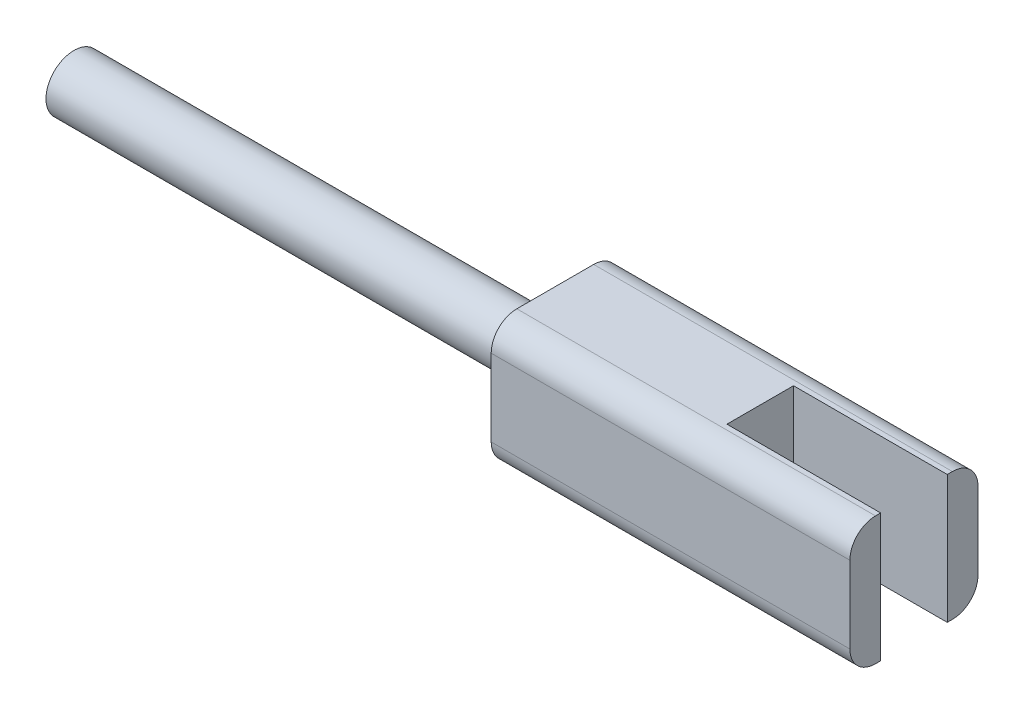
ISO-10303-21;
HEADER;
FILE_DESCRIPTION(('STEP AP214'),'2;1');
FILE_NAME('part.step','',(''),(''),'','','');
FILE_SCHEMA(('AUTOMOTIVE_DESIGN { 1 0 10303 214 1 1 1 1 }'));
ENDSEC;
DATA;
#1=APPLICATION_CONTEXT('core data for automotive mechanical design processes');
#2=APPLICATION_PROTOCOL_DEFINITION('international standard','automotive_design',2000,#1);
#3=PRODUCT_CONTEXT('',#1,'mechanical');
#4=PRODUCT('Part','Part','',(#3));
#5=PRODUCT_RELATED_PRODUCT_CATEGORY('part','',(#4));
#6=PRODUCT_DEFINITION_FORMATION('','',#4);
#7=PRODUCT_DEFINITION_CONTEXT('part definition',#1,'design');
#8=PRODUCT_DEFINITION('design','',#6,#7);
#9=PRODUCT_DEFINITION_SHAPE('','',#8);
#10=(LENGTH_UNIT() NAMED_UNIT(*) SI_UNIT(.MILLI.,.METRE.));
#11=(NAMED_UNIT(*) PLANE_ANGLE_UNIT() SI_UNIT($,.RADIAN.));
#12=(NAMED_UNIT(*) SI_UNIT($,.STERADIAN.) SOLID_ANGLE_UNIT());
#13=UNCERTAINTY_MEASURE_WITH_UNIT(LENGTH_MEASURE(1.E-05),#10,'distance_accuracy_value','');
#14=(GEOMETRIC_REPRESENTATION_CONTEXT(3) GLOBAL_UNCERTAINTY_ASSIGNED_CONTEXT((#13)) GLOBAL_UNIT_ASSIGNED_CONTEXT((#10,
#11,#12)) REPRESENTATION_CONTEXT('',''));
#15=CARTESIAN_POINT('',(0.,0.,0.));
#16=DIRECTION('',(0.,0.,1.));
#17=DIRECTION('',(1.,0.,0.));
#18=AXIS2_PLACEMENT_3D('',#15,#16,#17);
#19=CARTESIAN_POINT('',(32.786,-1.5,1.5));
#20=DIRECTION('',(1.,0.,0.));
#21=DIRECTION('',(0.,0.,-1.));
#22=AXIS2_PLACEMENT_3D('',#19,#20,#21);
#23=PLANE('',#22);
#24=DIRECTION('',(0.,1.,0.));
#25=VECTOR('',#24,1.);
#26=CARTESIAN_POINT('',(32.786,-1.5,-1.3));
#27=LINE('',#26,#25);
#28=CARTESIAN_POINT('',(32.786,-2.5,-1.3));
#29=VERTEX_POINT('',#28);
#30=CARTESIAN_POINT('',(32.786,2.5,-1.3));
#31=VERTEX_POINT('',#30);
#32=EDGE_CURVE('E11',#29,#31,#27,.T.);
#33=ORIENTED_EDGE('',*,*,#32,.F.);
#34=DIRECTION('',(0.,0.,-1.));
#35=VECTOR('',#34,1.);
#36=CARTESIAN_POINT('',(32.786,-2.5,1.5));
#37=LINE('',#36,#35);
#38=CARTESIAN_POINT('',(32.786,-2.5,-1.5));
#39=VERTEX_POINT('',#38);
#40=EDGE_CURVE('E202',#29,#39,#37,.T.);
#41=ORIENTED_EDGE('',*,*,#40,.T.);
#42=CARTESIAN_POINT('',(32.786,-1.5,-1.5));
#43=DIRECTION('',(1.,0.,0.));
#44=DIRECTION('',(0.,0.,-1.));
#45=AXIS2_PLACEMENT_3D('',#42,#43,#44);
#46=CIRCLE('',#45,1.);
#47=CARTESIAN_POINT('',(32.786,-1.5,-2.5));
#48=VERTEX_POINT('',#47);
#49=EDGE_CURVE('E201',#39,#48,#46,.T.);
#50=ORIENTED_EDGE('',*,*,#49,.T.);
#51=DIRECTION('',(0.,1.,0.));
#52=VECTOR('',#51,1.);
#53=CARTESIAN_POINT('',(32.786,-1.5,-2.5));
#54=LINE('',#53,#52);
#55=CARTESIAN_POINT('',(32.786,1.5,-2.5));
#56=VERTEX_POINT('',#55);
#57=EDGE_CURVE('E204',#48,#56,#54,.T.);
#58=ORIENTED_EDGE('',*,*,#57,.T.);
#59=CARTESIAN_POINT('',(32.786,1.5,-1.5));
#60=DIRECTION('',(1.,0.,0.));
#61=DIRECTION('',(0.,0.,-1.));
#62=AXIS2_PLACEMENT_3D('',#59,#60,#61);
#63=CIRCLE('',#62,1.);
#64=CARTESIAN_POINT('',(32.786,2.5,-1.5));
#65=VERTEX_POINT('',#64);
#66=EDGE_CURVE('E129',#56,#65,#63,.T.);
#67=ORIENTED_EDGE('',*,*,#66,.T.);
#68=DIRECTION('',(0.,0.,1.));
#69=VECTOR('',#68,1.);
#70=CARTESIAN_POINT('',(32.786,2.5,-1.5));
#71=LINE('',#70,#69);
#72=EDGE_CURVE('E128',#65,#31,#71,.T.);
#73=ORIENTED_EDGE('',*,*,#72,.T.);
#74=EDGE_LOOP('',(#33,#41,#50,#58,#67,#73));
#75=FACE_BOUND('',#74,.T.);
#76=ADVANCED_FACE('F39',(#75),#23,.T.);
#77=CARTESIAN_POINT('',(20.786,0.,0.));
#78=DIRECTION('',(-1.,0.,0.));
#79=DIRECTION('',(0.,0.,1.));
#80=AXIS2_PLACEMENT_3D('',#77,#78,#79);
#81=CYLINDRICAL_SURFACE('',#80,1.09);
#82=CARTESIAN_POINT('',(0.,0.,0.));
#83=DIRECTION('',(1.,0.,0.));
#84=DIRECTION('',(0.,0.,-1.));
#85=AXIS2_PLACEMENT_3D('',#82,#83,#84);
#86=CIRCLE('',#85,1.09);
#87=CARTESIAN_POINT('',(0.,0.,1.09));
#88=VERTEX_POINT('',#87);
#89=EDGE_CURVE('E181',#88,#88,#86,.T.);
#90=CARTESIAN_POINT('',(18.786,0.,0.));
#91=DIRECTION('',(1.,0.,0.));
#92=DIRECTION('',(0.,0.,-1.));
#93=AXIS2_PLACEMENT_3D('',#90,#91,#92);
#94=CIRCLE('',#93,1.09);
#95=CARTESIAN_POINT('',(18.786,0.,1.09));
#96=VERTEX_POINT('',#95);
#97=EDGE_CURVE('E184',#96,#96,#94,.T.);
#98=CARTESIAN_POINT('',(0.,0.,1.09));
#99=CARTESIAN_POINT('',(0.1956875,0.,1.09));
#100=CARTESIAN_POINT('',(0.391374999999999,0.,1.09));
#101=CARTESIAN_POINT('',(0.78275,0.,1.09));
#102=CARTESIAN_POINT('',(0.978437500000001,0.,1.09));
#103=CARTESIAN_POINT('',(1.3698125,0.,1.09));
#104=CARTESIAN_POINT('',(1.5655,0.,1.09));
#105=CARTESIAN_POINT('',(1.956875,0.,1.09));
#106=CARTESIAN_POINT('',(2.1525625,0.,1.09));
#107=CARTESIAN_POINT('',(2.5439375,0.,1.09));
#108=CARTESIAN_POINT('',(2.739625,0.,1.09));
#109=CARTESIAN_POINT('',(3.131,0.,1.09));
#110=CARTESIAN_POINT('',(3.3266875,0.,1.09));
#111=CARTESIAN_POINT('',(3.7180625,0.,1.09));
#112=CARTESIAN_POINT('',(3.91375,0.,1.09));
#113=CARTESIAN_POINT('',(4.305125,0.,1.09));
#114=CARTESIAN_POINT('',(4.5008125,0.,1.09));
#115=CARTESIAN_POINT('',(4.8921875,0.,1.09));
#116=CARTESIAN_POINT('',(5.087875,0.,1.09));
#117=CARTESIAN_POINT('',(5.47925,0.,1.09));
#118=CARTESIAN_POINT('',(5.6749375,0.,1.09));
#119=CARTESIAN_POINT('',(6.0663125,0.,1.09));
#120=CARTESIAN_POINT('',(6.262,0.,1.09));
#121=CARTESIAN_POINT('',(6.653375,0.,1.09));
#122=CARTESIAN_POINT('',(6.8490625,0.,1.09));
#123=CARTESIAN_POINT('',(7.2404375,0.,1.09));
#124=CARTESIAN_POINT('',(7.436125,0.,1.09));
#125=CARTESIAN_POINT('',(7.8275,0.,1.09));
#126=CARTESIAN_POINT('',(8.0231875,0.,1.09));
#127=CARTESIAN_POINT('',(8.4145625,0.,1.09));
#128=CARTESIAN_POINT('',(8.61025,0.,1.09));
#129=CARTESIAN_POINT('',(9.001625,0.,1.09));
#130=CARTESIAN_POINT('',(9.1973125,0.,1.09));
#131=CARTESIAN_POINT('',(9.5886875,0.,1.09));
#132=CARTESIAN_POINT('',(9.784375,0.,1.09));
#133=CARTESIAN_POINT('',(10.17575,0.,1.09));
#134=CARTESIAN_POINT('',(10.3714375,0.,1.09));
#135=CARTESIAN_POINT('',(10.7628125,0.,1.09));
#136=CARTESIAN_POINT('',(10.9585,0.,1.09));
#137=CARTESIAN_POINT('',(11.349875,0.,1.09));
#138=CARTESIAN_POINT('',(11.5455625,0.,1.09));
#139=CARTESIAN_POINT('',(11.9369375,0.,1.09));
#140=CARTESIAN_POINT('',(12.132625,0.,1.09));
#141=CARTESIAN_POINT('',(12.524,0.,1.09));
#142=CARTESIAN_POINT('',(12.7196875,0.,1.09));
#143=CARTESIAN_POINT('',(13.1110625,0.,1.09));
#144=CARTESIAN_POINT('',(13.30675,0.,1.09));
#145=CARTESIAN_POINT('',(13.698125,0.,1.09));
#146=CARTESIAN_POINT('',(13.8938125,0.,1.09));
#147=CARTESIAN_POINT('',(14.2851875,0.,1.09));
#148=CARTESIAN_POINT('',(14.480875,0.,1.09));
#149=CARTESIAN_POINT('',(14.87225,0.,1.09));
#150=CARTESIAN_POINT('',(15.0679375,0.,1.09));
#151=CARTESIAN_POINT('',(15.4593125,0.,1.09));
#152=CARTESIAN_POINT('',(15.655,0.,1.09));
#153=CARTESIAN_POINT('',(16.046375,0.,1.09));
#154=CARTESIAN_POINT('',(16.2420625,0.,1.09));
#155=CARTESIAN_POINT('',(16.6334375,0.,1.09));
#156=CARTESIAN_POINT('',(16.829125,0.,1.09));
#157=CARTESIAN_POINT('',(17.2205,0.,1.09));
#158=CARTESIAN_POINT('',(17.4161875,0.,1.09));
#159=CARTESIAN_POINT('',(17.8075625,0.,1.09));
#160=CARTESIAN_POINT('',(18.00325,0.,1.09));
#161=CARTESIAN_POINT('',(18.394625,0.,1.09));
#162=CARTESIAN_POINT('',(18.5903125,0.,1.09));
#163=CARTESIAN_POINT('',(18.786,0.,1.09));
#164=B_SPLINE_CURVE_WITH_KNOTS('',3,(#98,#99,#100,#101,#102,#103,#104,#105,#106,#107,#108,#109,
#110,#111,#112,#113,#114,#115,#116,#117,#118,#119,#120,#121,#122,#123,#124,#125,#126,#127,#128,
#129,#130,#131,#132,#133,#134,#135,#136,#137,#138,#139,#140,#141,#142,#143,#144,#145,#146,#147,
#148,#149,#150,#151,#152,#153,#154,#155,#156,#157,#158,#159,#160,#161,#162,#163),.UNSPECIFIED.,
.F.,.F.,(4,2,2,2,2,2,2,2,2,2,2,2,2,2,2,2,2,2,2,2,2,2,2,2,2,2,2,2,2,2,2,2,4),(0.,
0.587062499999999,1.174125,1.7611875,2.34825,2.9353125,3.522375,4.1094375,4.6965,5.2835625,
5.870625,6.4576875,7.04475,7.6318125,8.218875,8.8059375,9.393,9.9800625,10.567125,11.1541875,
11.74125,12.3283125,12.915375,13.5024375,14.0895,14.6765625,15.263625,15.8506875,16.43775,
17.0248125,17.611875,18.1989375,18.786),.UNSPECIFIED.);
#165=EDGE_CURVE('BSEAM41',#88,#96,#164,.T.);
#166=ORIENTED_EDGE('',*,*,#89,.T.);
#167=ORIENTED_EDGE('',*,*,#97,.F.);
#168=ORIENTED_EDGE('',*,*,#165,.T.);
#169=ORIENTED_EDGE('',*,*,#165,.F.);
#170=EDGE_LOOP('',(#166,#168,#167,#169));
#171=FACE_BOUND('',#170,.T.);
#172=ADVANCED_FACE('F41',(#171),#81,.T.);
#173=CARTESIAN_POINT('',(0.,0.,0.));
#174=DIRECTION('',(1.,0.,0.));
#175=DIRECTION('',(0.,0.,-1.));
#176=AXIS2_PLACEMENT_3D('',#173,#174,#175);
#177=PLANE('',#176);
#178=ORIENTED_EDGE('',*,*,#89,.F.);
#179=EDGE_LOOP('',(#178));
#180=FACE_BOUND('',#179,.T.);
#181=ADVANCED_FACE('F264',(#180),#177,.F.);
#182=CARTESIAN_POINT('',(32.786,-1.5,1.5));
#183=DIRECTION('',(-1.,0.,0.));
#184=DIRECTION('',(0.,0.,1.));
#185=AXIS2_PLACEMENT_3D('',#182,#183,#184);
#186=CYLINDRICAL_SURFACE('',#185,1.);
#187=CARTESIAN_POINT('',(18.786,-1.5,1.5));
#188=DIRECTION('',(1.,0.,0.));
#189=DIRECTION('',(0.,0.,-1.));
#190=AXIS2_PLACEMENT_3D('',#187,#188,#189);
#191=CIRCLE('',#190,1.);
#192=CARTESIAN_POINT('',(18.786,-1.5,2.5));
#193=VERTEX_POINT('',#192);
#194=CARTESIAN_POINT('',(18.786,-2.5,1.5));
#195=VERTEX_POINT('',#194);
#196=EDGE_CURVE('E150',#193,#195,#191,.T.);
#197=ORIENTED_EDGE('',*,*,#196,.T.);
#198=DIRECTION('',(-1.,0.,0.));
#199=VECTOR('',#198,1.);
#200=CARTESIAN_POINT('',(32.786,-2.5,1.5));
#201=LINE('',#200,#199);
#202=CARTESIAN_POINT('',(32.786,-2.5,1.5));
#203=VERTEX_POINT('',#202);
#204=EDGE_CURVE('E179',#203,#195,#201,.T.);
#205=ORIENTED_EDGE('',*,*,#204,.F.);
#206=CARTESIAN_POINT('',(32.786,-1.5,1.5));
#207=DIRECTION('',(1.,0.,0.));
#208=DIRECTION('',(0.,0.,-1.));
#209=AXIS2_PLACEMENT_3D('',#206,#207,#208);
#210=CIRCLE('',#209,1.);
#211=CARTESIAN_POINT('',(32.786,-1.5,2.5));
#212=VERTEX_POINT('',#211);
#213=EDGE_CURVE('E166',#212,#203,#210,.T.);
#214=ORIENTED_EDGE('',*,*,#213,.F.);
#215=DIRECTION('',(-1.,0.,0.));
#216=VECTOR('',#215,1.);
#217=CARTESIAN_POINT('',(32.786,-1.5,2.5));
#218=LINE('',#217,#216);
#219=EDGE_CURVE('E145',#212,#193,#218,.T.);
#220=ORIENTED_EDGE('',*,*,#219,.T.);
#221=EDGE_LOOP('',(#197,#205,#214,#220));
#222=FACE_BOUND('',#221,.T.);
#223=ADVANCED_FACE('F262',(#222),#186,.T.);
#224=CARTESIAN_POINT('',(32.786,-2.5,1.5));
#225=DIRECTION('',(0.,1.,0.));
#226=DIRECTION('',(0.,0.,1.));
#227=AXIS2_PLACEMENT_3D('',#224,#225,#226);
#228=PLANE('',#227);
#229=ORIENTED_EDGE('',*,*,#40,.F.);
#230=DIRECTION('',(-1.,0.,0.));
#231=VECTOR('',#230,1.);
#232=CARTESIAN_POINT('',(26.786,-2.5,-1.3));
#233=LINE('',#232,#231);
#234=CARTESIAN_POINT('',(26.786,-2.5,-1.3));
#235=VERTEX_POINT('',#234);
#236=EDGE_CURVE('E197',#29,#235,#233,.T.);
#237=ORIENTED_EDGE('',*,*,#236,.T.);
#238=DIRECTION('',(0.,0.,1.));
#239=VECTOR('',#238,1.);
#240=CARTESIAN_POINT('',(26.786,-2.5,1.3));
#241=LINE('',#240,#239);
#242=CARTESIAN_POINT('',(26.786,-2.5,1.3));
#243=VERTEX_POINT('',#242);
#244=EDGE_CURVE('E196',#235,#243,#241,.T.);
#245=ORIENTED_EDGE('',*,*,#244,.T.);
#246=DIRECTION('',(1.,0.,0.));
#247=VECTOR('',#246,1.);
#248=CARTESIAN_POINT('',(33.786,-2.5,1.3));
#249=LINE('',#248,#247);
#250=CARTESIAN_POINT('',(32.786,-2.5,1.3));
#251=VERTEX_POINT('',#250);
#252=EDGE_CURVE('E189',#243,#251,#249,.T.);
#253=ORIENTED_EDGE('',*,*,#252,.T.);
#254=EDGE_CURVE('E105',#203,#251,#37,.T.);
#255=ORIENTED_EDGE('',*,*,#254,.F.);
#256=ORIENTED_EDGE('',*,*,#204,.T.);
#257=DIRECTION('',(0.,0.,-1.));
#258=VECTOR('',#257,1.);
#259=CARTESIAN_POINT('',(18.786,-2.5,1.5));
#260=LINE('',#259,#258);
#261=CARTESIAN_POINT('',(18.786,-2.5,-1.5));
#262=VERTEX_POINT('',#261);
#263=EDGE_CURVE('E153',#195,#262,#260,.T.);
#264=ORIENTED_EDGE('',*,*,#263,.T.);
#265=DIRECTION('',(-1.,0.,0.));
#266=VECTOR('',#265,1.);
#267=CARTESIAN_POINT('',(32.786,-2.5,-1.5));
#268=LINE('',#267,#266);
#269=EDGE_CURVE('E176',#39,#262,#268,.T.);
#270=ORIENTED_EDGE('',*,*,#269,.F.);
#271=EDGE_LOOP('',(#229,#237,#245,#253,#255,#256,#264,#270));
#272=FACE_BOUND('',#271,.T.);
#273=ADVANCED_FACE('F193',(#272),#228,.F.);
#274=CARTESIAN_POINT('',(32.786,-1.5,-1.5));
#275=DIRECTION('',(-1.,0.,0.));
#276=DIRECTION('',(0.,0.,1.));
#277=AXIS2_PLACEMENT_3D('',#274,#275,#276);
#278=CYLINDRICAL_SURFACE('',#277,1.);
#279=CARTESIAN_POINT('',(18.786,-1.5,-1.5));
#280=DIRECTION('',(1.,0.,0.));
#281=DIRECTION('',(0.,0.,-1.));
#282=AXIS2_PLACEMENT_3D('',#279,#280,#281);
#283=CIRCLE('',#282,1.);
#284=CARTESIAN_POINT('',(18.786,-1.5,-2.5));
#285=VERTEX_POINT('',#284);
#286=EDGE_CURVE('E156',#262,#285,#283,.T.);
#287=ORIENTED_EDGE('',*,*,#286,.T.);
#288=DIRECTION('',(-1.,0.,0.));
#289=VECTOR('',#288,1.);
#290=CARTESIAN_POINT('',(32.786,-1.5,-2.5));
#291=LINE('',#290,#289);
#292=EDGE_CURVE('E173',#48,#285,#291,.T.);
#293=ORIENTED_EDGE('',*,*,#292,.F.);
#294=ORIENTED_EDGE('',*,*,#49,.F.);
#295=ORIENTED_EDGE('',*,*,#269,.T.);
#296=EDGE_LOOP('',(#287,#293,#294,#295));
#297=FACE_BOUND('',#296,.T.);
#298=ADVANCED_FACE('F253',(#297),#278,.T.);
#299=CARTESIAN_POINT('',(32.786,-1.5,-2.5));
#300=DIRECTION('',(0.,0.,1.));
#301=DIRECTION('',(1.,0.,0.));
#302=AXIS2_PLACEMENT_3D('',#299,#300,#301);
#303=PLANE('',#302);
#304=DIRECTION('',(0.,1.,0.));
#305=VECTOR('',#304,1.);
#306=CARTESIAN_POINT('',(18.786,-1.5,-2.5));
#307=LINE('',#306,#305);
#308=CARTESIAN_POINT('',(18.786,1.5,-2.5));
#309=VERTEX_POINT('',#308);
#310=EDGE_CURVE('E158',#285,#309,#307,.T.);
#311=ORIENTED_EDGE('',*,*,#310,.T.);
#312=DIRECTION('',(-1.,0.,0.));
#313=VECTOR('',#312,1.);
#314=CARTESIAN_POINT('',(32.786,1.5,-2.5));
#315=LINE('',#314,#313);
#316=EDGE_CURVE('E170',#56,#309,#315,.T.);
#317=ORIENTED_EDGE('',*,*,#316,.F.);
#318=ORIENTED_EDGE('',*,*,#57,.F.);
#319=ORIENTED_EDGE('',*,*,#292,.T.);
#320=EDGE_LOOP('',(#311,#317,#318,#319));
#321=FACE_BOUND('',#320,.T.);
#322=ADVANCED_FACE('F256',(#321),#303,.F.);
#323=CARTESIAN_POINT('',(32.786,1.5,-1.5));
#324=DIRECTION('',(-1.,0.,0.));
#325=DIRECTION('',(0.,0.,1.));
#326=AXIS2_PLACEMENT_3D('',#323,#324,#325);
#327=CYLINDRICAL_SURFACE('',#326,1.);
#328=CARTESIAN_POINT('',(18.786,1.5,-1.5));
#329=DIRECTION('',(1.,0.,0.));
#330=DIRECTION('',(0.,0.,-1.));
#331=AXIS2_PLACEMENT_3D('',#328,#329,#330);
#332=CIRCLE('',#331,1.);
#333=CARTESIAN_POINT('',(18.786,2.5,-1.5));
#334=VERTEX_POINT('',#333);
#335=EDGE_CURVE('E160',#309,#334,#332,.T.);
#336=ORIENTED_EDGE('',*,*,#335,.T.);
#337=DIRECTION('',(-1.,0.,0.));
#338=VECTOR('',#337,1.);
#339=CARTESIAN_POINT('',(32.786,2.5,-1.5));
#340=LINE('',#339,#338);
#341=EDGE_CURVE('E140',#65,#334,#340,.T.);
#342=ORIENTED_EDGE('',*,*,#341,.F.);
#343=ORIENTED_EDGE('',*,*,#66,.F.);
#344=ORIENTED_EDGE('',*,*,#316,.T.);
#345=EDGE_LOOP('',(#336,#342,#343,#344));
#346=FACE_BOUND('',#345,.T.);
#347=ADVANCED_FACE('F218',(#346),#327,.T.);
#348=CARTESIAN_POINT('',(32.786,2.5,-1.5));
#349=DIRECTION('',(0.,-1.,0.));
#350=DIRECTION('',(0.,0.,-1.));
#351=AXIS2_PLACEMENT_3D('',#348,#349,#350);
#352=PLANE('',#351);
#353=DIRECTION('',(0.,0.,1.));
#354=VECTOR('',#353,1.);
#355=CARTESIAN_POINT('',(26.786,2.5,1.3));
#356=LINE('',#355,#354);
#357=CARTESIAN_POINT('',(26.786,2.5,-1.3));
#358=VERTEX_POINT('',#357);
#359=CARTESIAN_POINT('',(26.786,2.5,1.3));
#360=VERTEX_POINT('',#359);
#361=EDGE_CURVE('E225',#358,#360,#356,.T.);
#362=ORIENTED_EDGE('',*,*,#361,.F.);
#363=DIRECTION('',(-1.,0.,0.));
#364=VECTOR('',#363,1.);
#365=CARTESIAN_POINT('',(26.786,2.5,-1.3));
#366=LINE('',#365,#364);
#367=EDGE_CURVE('E222',#31,#358,#366,.T.);
#368=ORIENTED_EDGE('',*,*,#367,.F.);
#369=ORIENTED_EDGE('',*,*,#72,.F.);
#370=ORIENTED_EDGE('',*,*,#341,.T.);
#371=DIRECTION('',(0.,0.,1.));
#372=VECTOR('',#371,1.);
#373=CARTESIAN_POINT('',(18.786,2.5,-1.5));
#374=LINE('',#373,#372);
#375=CARTESIAN_POINT('',(18.786,2.5,1.5));
#376=VERTEX_POINT('',#375);
#377=EDGE_CURVE('E137',#334,#376,#374,.T.);
#378=ORIENTED_EDGE('',*,*,#377,.T.);
#379=DIRECTION('',(-1.,0.,0.));
#380=VECTOR('',#379,1.);
#381=CARTESIAN_POINT('',(32.786,2.5,1.5));
#382=LINE('',#381,#380);
#383=CARTESIAN_POINT('',(32.786,2.5,1.5));
#384=VERTEX_POINT('',#383);
#385=EDGE_CURVE('E132',#384,#376,#382,.T.);
#386=ORIENTED_EDGE('',*,*,#385,.F.);
#387=CARTESIAN_POINT('',(32.786,2.5,1.3));
#388=VERTEX_POINT('',#387);
#389=EDGE_CURVE('E121',#388,#384,#71,.T.);
#390=ORIENTED_EDGE('',*,*,#389,.F.);
#391=DIRECTION('',(1.,0.,0.));
#392=VECTOR('',#391,1.);
#393=CARTESIAN_POINT('',(33.786,2.5,1.3));
#394=LINE('',#393,#392);
#395=EDGE_CURVE('E54',#360,#388,#394,.T.);
#396=ORIENTED_EDGE('',*,*,#395,.F.);
#397=EDGE_LOOP('',(#362,#368,#369,#370,#378,#386,#390,#396));
#398=FACE_BOUND('',#397,.T.);
#399=ADVANCED_FACE('F134',(#398),#352,.F.);
#400=CARTESIAN_POINT('',(32.786,1.5,1.5));
#401=DIRECTION('',(-1.,0.,0.));
#402=DIRECTION('',(0.,0.,1.));
#403=AXIS2_PLACEMENT_3D('',#400,#401,#402);
#404=CYLINDRICAL_SURFACE('',#403,1.);
#405=CARTESIAN_POINT('',(18.786,1.5,1.5));
#406=DIRECTION('',(1.,0.,0.));
#407=DIRECTION('',(0.,0.,-1.));
#408=AXIS2_PLACEMENT_3D('',#405,#406,#407);
#409=CIRCLE('',#408,1.);
#410=CARTESIAN_POINT('',(18.786,1.5,2.5));
#411=VERTEX_POINT('',#410);
#412=EDGE_CURVE('E163',#376,#411,#409,.T.);
#413=ORIENTED_EDGE('',*,*,#412,.T.);
#414=DIRECTION('',(-1.,0.,0.));
#415=VECTOR('',#414,1.);
#416=CARTESIAN_POINT('',(32.786,1.5,2.5));
#417=LINE('',#416,#415);
#418=CARTESIAN_POINT('',(32.786,1.5,2.5));
#419=VERTEX_POINT('',#418);
#420=EDGE_CURVE('E141',#419,#411,#417,.T.);
#421=ORIENTED_EDGE('',*,*,#420,.F.);
#422=CARTESIAN_POINT('',(32.786,1.5,1.5));
#423=DIRECTION('',(1.,0.,0.));
#424=DIRECTION('',(0.,0.,-1.));
#425=AXIS2_PLACEMENT_3D('',#422,#423,#424);
#426=CIRCLE('',#425,1.);
#427=EDGE_CURVE('E125',#384,#419,#426,.T.);
#428=ORIENTED_EDGE('',*,*,#427,.F.);
#429=ORIENTED_EDGE('',*,*,#385,.T.);
#430=EDGE_LOOP('',(#413,#421,#428,#429));
#431=FACE_BOUND('',#430,.T.);
#432=ADVANCED_FACE('F143',(#431),#404,.T.);
#433=CARTESIAN_POINT('',(32.786,1.5,2.5));
#434=DIRECTION('',(0.,0.,-1.));
#435=DIRECTION('',(-1.,0.,0.));
#436=AXIS2_PLACEMENT_3D('',#433,#434,#435);
#437=PLANE('',#436);
#438=DIRECTION('',(0.,-1.,0.));
#439=VECTOR('',#438,1.);
#440=CARTESIAN_POINT('',(18.786,1.5,2.5));
#441=LINE('',#440,#439);
#442=EDGE_CURVE('E96',#411,#193,#441,.T.);
#443=ORIENTED_EDGE('',*,*,#442,.T.);
#444=ORIENTED_EDGE('',*,*,#219,.F.);
#445=DIRECTION('',(0.,-1.,0.));
#446=VECTOR('',#445,1.);
#447=CARTESIAN_POINT('',(32.786,1.5,2.5));
#448=LINE('',#447,#446);
#449=EDGE_CURVE('E63',#419,#212,#448,.T.);
#450=ORIENTED_EDGE('',*,*,#449,.F.);
#451=ORIENTED_EDGE('',*,*,#420,.T.);
#452=EDGE_LOOP('',(#443,#444,#450,#451));
#453=FACE_BOUND('',#452,.T.);
#454=ADVANCED_FACE('F260',(#453),#437,.F.);
#455=DIRECTION('',(0.,-1.,0.));
#456=VECTOR('',#455,1.);
#457=CARTESIAN_POINT('',(32.786,-1.5,1.3));
#458=LINE('',#457,#456);
#459=EDGE_CURVE('E47',#388,#251,#458,.T.);
#460=ORIENTED_EDGE('',*,*,#459,.F.);
#461=ORIENTED_EDGE('',*,*,#389,.T.);
#462=ORIENTED_EDGE('',*,*,#427,.T.);
#463=ORIENTED_EDGE('',*,*,#449,.T.);
#464=ORIENTED_EDGE('',*,*,#213,.T.);
#465=ORIENTED_EDGE('',*,*,#254,.T.);
#466=EDGE_LOOP('',(#460,#461,#462,#463,#464,#465));
#467=FACE_BOUND('',#466,.T.);
#468=ADVANCED_FACE('F123',(#467),#23,.T.);
#469=CARTESIAN_POINT('',(18.786,-1.5,1.5));
#470=DIRECTION('',(1.,0.,0.));
#471=DIRECTION('',(0.,0.,-1.));
#472=AXIS2_PLACEMENT_3D('',#469,#470,#471);
#473=PLANE('',#472);
#474=ORIENTED_EDGE('',*,*,#97,.T.);
#475=EDGE_LOOP('',(#474));
#476=FACE_BOUND('',#475,.T.);
#477=ORIENTED_EDGE('',*,*,#196,.F.);
#478=ORIENTED_EDGE('',*,*,#442,.F.);
#479=ORIENTED_EDGE('',*,*,#412,.F.);
#480=ORIENTED_EDGE('',*,*,#377,.F.);
#481=ORIENTED_EDGE('',*,*,#335,.F.);
#482=ORIENTED_EDGE('',*,*,#310,.F.);
#483=ORIENTED_EDGE('',*,*,#286,.F.);
#484=ORIENTED_EDGE('',*,*,#263,.F.);
#485=EDGE_LOOP('',(#477,#478,#479,#480,#481,#482,#483,#484));
#486=FACE_BOUND('',#485,.T.);
#487=ADVANCED_FACE('F259',(#476,#486),#473,.F.);
#488=CARTESIAN_POINT('',(26.786,-2.5,1.3));
#489=DIRECTION('',(-1.,0.,0.));
#490=DIRECTION('',(0.,0.,1.));
#491=AXIS2_PLACEMENT_3D('',#488,#489,#490);
#492=PLANE('',#491);
#493=DIRECTION('',(0.,1.,0.));
#494=VECTOR('',#493,1.);
#495=CARTESIAN_POINT('',(26.786,-2.5,1.3));
#496=LINE('',#495,#494);
#497=EDGE_CURVE('E237',#243,#360,#496,.T.);
#498=ORIENTED_EDGE('',*,*,#497,.F.);
#499=ORIENTED_EDGE('',*,*,#244,.F.);
#500=DIRECTION('',(0.,1.,0.));
#501=VECTOR('',#500,1.);
#502=CARTESIAN_POINT('',(26.786,-2.5,-1.3));
#503=LINE('',#502,#501);
#504=EDGE_CURVE('E154',#235,#358,#503,.T.);
#505=ORIENTED_EDGE('',*,*,#504,.T.);
#506=ORIENTED_EDGE('',*,*,#361,.T.);
#507=EDGE_LOOP('',(#498,#499,#505,#506));
#508=FACE_BOUND('',#507,.T.);
#509=ADVANCED_FACE('F242',(#508),#492,.F.);
#510=CARTESIAN_POINT('',(26.786,-2.5,-1.3));
#511=DIRECTION('',(0.,0.,-1.));
#512=DIRECTION('',(-1.,0.,0.));
#513=AXIS2_PLACEMENT_3D('',#510,#511,#512);
#514=PLANE('',#513);
#515=ORIENTED_EDGE('',*,*,#32,.T.);
#516=ORIENTED_EDGE('',*,*,#367,.T.);
#517=ORIENTED_EDGE('',*,*,#504,.F.);
#518=ORIENTED_EDGE('',*,*,#236,.F.);
#519=EDGE_LOOP('',(#515,#516,#517,#518));
#520=FACE_BOUND('',#519,.T.);
#521=ADVANCED_FACE('F245',(#520),#514,.F.);
#522=CARTESIAN_POINT('',(33.786,-2.5,1.3));
#523=DIRECTION('',(0.,0.,1.));
#524=DIRECTION('',(1.,0.,0.));
#525=AXIS2_PLACEMENT_3D('',#522,#523,#524);
#526=PLANE('',#525);
#527=ORIENTED_EDGE('',*,*,#459,.T.);
#528=ORIENTED_EDGE('',*,*,#252,.F.);
#529=ORIENTED_EDGE('',*,*,#497,.T.);
#530=ORIENTED_EDGE('',*,*,#395,.T.);
#531=EDGE_LOOP('',(#527,#528,#529,#530));
#532=FACE_BOUND('',#531,.T.);
#533=ADVANCED_FACE('F187',(#532),#526,.F.);
#534=CLOSED_SHELL('',(#76,#172,#181,#223,#273,#298,#322,#347,#399,#432,#454,#468,#487,#509,#521,#533));
#535=MANIFOLD_SOLID_BREP('B2',#534);
#536=ADVANCED_BREP_SHAPE_REPRESENTATION('',(#18,#535),#14);
#537=SHAPE_DEFINITION_REPRESENTATION(#9,#536);
ENDSEC;
END-ISO-10303-21;
